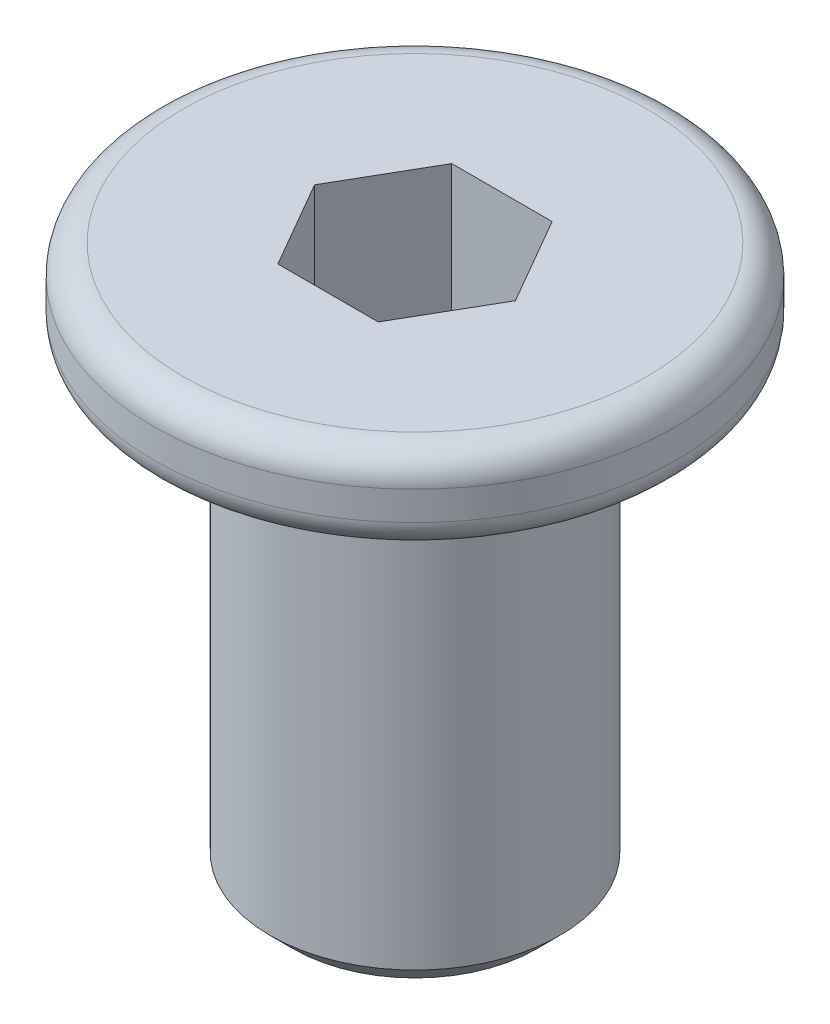
ISO-10303-21;
HEADER;
FILE_DESCRIPTION(('STEP AP214'),'2;1');
FILE_NAME('part.step','',(''),(''),'','','');
FILE_SCHEMA(('AUTOMOTIVE_DESIGN { 1 0 10303 214 1 1 1 1 }'));
ENDSEC;
DATA;
#1=APPLICATION_CONTEXT('core data for automotive mechanical design processes');
#2=APPLICATION_PROTOCOL_DEFINITION('international standard','automotive_design',2000,#1);
#3=PRODUCT_CONTEXT('',#1,'mechanical');
#4=PRODUCT('Part','Part','',(#3));
#5=PRODUCT_RELATED_PRODUCT_CATEGORY('part','',(#4));
#6=PRODUCT_DEFINITION_FORMATION('','',#4);
#7=PRODUCT_DEFINITION_CONTEXT('part definition',#1,'design');
#8=PRODUCT_DEFINITION('design','',#6,#7);
#9=PRODUCT_DEFINITION_SHAPE('','',#8);
#10=(LENGTH_UNIT() NAMED_UNIT(*) SI_UNIT(.MILLI.,.METRE.));
#11=(NAMED_UNIT(*) PLANE_ANGLE_UNIT() SI_UNIT($,.RADIAN.));
#12=(NAMED_UNIT(*) SI_UNIT($,.STERADIAN.) SOLID_ANGLE_UNIT());
#13=UNCERTAINTY_MEASURE_WITH_UNIT(LENGTH_MEASURE(1.E-05),#10,'distance_accuracy_value','');
#14=(GEOMETRIC_REPRESENTATION_CONTEXT(3) GLOBAL_UNCERTAINTY_ASSIGNED_CONTEXT((#13)) GLOBAL_UNIT_ASSIGNED_CONTEXT((#10,
#11,#12)) REPRESENTATION_CONTEXT('',''));
#15=CARTESIAN_POINT('',(0.,0.,0.));
#16=DIRECTION('',(0.,0.,1.));
#17=DIRECTION('',(1.,0.,0.));
#18=AXIS2_PLACEMENT_3D('',#15,#16,#17);
#19=CARTESIAN_POINT('',(0.,-1.,0.));
#20=DIRECTION('',(0.,1.,0.));
#21=DIRECTION('',(0.,0.,1.));
#22=AXIS2_PLACEMENT_3D('',#19,#20,#21);
#23=TOROIDAL_SURFACE('',#22,4.,0.5);
#24=CARTESIAN_POINT('',(0.,-1.5,0.));
#25=DIRECTION('',(0.,1.,0.));
#26=DIRECTION('',(0.,0.,1.));
#27=AXIS2_PLACEMENT_3D('',#24,#25,#26);
#28=CIRCLE('',#27,4.);
#29=CARTESIAN_POINT('',(0.,-1.5,4.));
#30=VERTEX_POINT('',#29);
#31=EDGE_CURVE('E190',#30,#30,#28,.T.);
#32=ORIENTED_EDGE('',*,*,#31,.T.);
#33=EDGE_LOOP('',(#32));
#34=FACE_BOUND('',#33,.T.);
#35=CARTESIAN_POINT('',(0.,-0.999999999999997,0.));
#36=DIRECTION('',(0.,1.,0.));
#37=DIRECTION('',(0.,0.,1.));
#38=AXIS2_PLACEMENT_3D('',#35,#36,#37);
#39=CIRCLE('',#38,4.5);
#40=CARTESIAN_POINT('',(0.,-0.999999999999997,4.5));
#41=VERTEX_POINT('',#40);
#42=EDGE_CURVE('E157',#41,#41,#39,.T.);
#43=ORIENTED_EDGE('',*,*,#42,.F.);
#44=EDGE_LOOP('',(#43));
#45=FACE_BOUND('',#44,.T.);
#46=ADVANCED_FACE('F45',(#34,#45),#23,.T.);
#47=CARTESIAN_POINT('',(-4.,-1.5,0.));
#48=DIRECTION('',(0.,-1.,0.));
#49=DIRECTION('',(0.,0.,-1.));
#50=AXIS2_PLACEMENT_3D('',#47,#48,#49);
#51=PLANE('',#50);
#52=CARTESIAN_POINT('',(0.,-1.5,0.));
#53=DIRECTION('',(0.,1.,0.));
#54=DIRECTION('',(0.,0.,1.));
#55=AXIS2_PLACEMENT_3D('',#52,#53,#54);
#56=CIRCLE('',#55,2.5);
#57=CARTESIAN_POINT('',(0.,-1.5,2.5));
#58=VERTEX_POINT('',#57);
#59=EDGE_CURVE('E187',#58,#58,#56,.T.);
#60=ORIENTED_EDGE('',*,*,#59,.T.);
#61=EDGE_LOOP('',(#60));
#62=FACE_BOUND('',#61,.T.);
#63=ORIENTED_EDGE('',*,*,#31,.F.);
#64=EDGE_LOOP('',(#63));
#65=FACE_BOUND('',#64,.T.);
#66=ADVANCED_FACE('F250',(#62,#65),#51,.T.);
#67=CARTESIAN_POINT('',(0.,2.75,0.));
#68=DIRECTION('',(0.,1.,0.));
#69=DIRECTION('',(0.,0.,1.));
#70=AXIS2_PLACEMENT_3D('',#67,#68,#69);
#71=CYLINDRICAL_SURFACE('',#70,2.5);
#72=CARTESIAN_POINT('',(0.,-9.1,0.));
#73=DIRECTION('',(0.,1.,0.));
#74=DIRECTION('',(0.,0.,1.));
#75=AXIS2_PLACEMENT_3D('',#72,#73,#74);
#76=CIRCLE('',#75,2.5);
#77=CARTESIAN_POINT('',(0.,-9.1,2.5));
#78=VERTEX_POINT('',#77);
#79=EDGE_CURVE('E184',#78,#78,#76,.T.);
#80=ORIENTED_EDGE('',*,*,#79,.T.);
#81=EDGE_LOOP('',(#80));
#82=FACE_BOUND('',#81,.T.);
#83=ORIENTED_EDGE('',*,*,#59,.F.);
#84=EDGE_LOOP('',(#83));
#85=FACE_BOUND('',#84,.T.);
#86=ADVANCED_FACE('F255',(#82,#85),#71,.T.);
#87=CARTESIAN_POINT('',(0.,-9.1,0.));
#88=DIRECTION('',(0.,1.,0.));
#89=DIRECTION('',(0.,0.,1.));
#90=AXIS2_PLACEMENT_3D('',#87,#88,#89);
#91=CONICAL_SURFACE('',#90,2.5,0.785398163397449);
#92=CARTESIAN_POINT('',(0.,-9.5,0.));
#93=DIRECTION('',(0.,1.,0.));
#94=DIRECTION('',(0.,0.,1.));
#95=AXIS2_PLACEMENT_3D('',#92,#93,#94);
#96=CIRCLE('',#95,2.1);
#97=CARTESIAN_POINT('',(0.,-9.5,2.1));
#98=VERTEX_POINT('',#97);
#99=EDGE_CURVE('E180',#98,#98,#96,.T.);
#100=ORIENTED_EDGE('',*,*,#99,.T.);
#101=EDGE_LOOP('',(#100));
#102=FACE_BOUND('',#101,.T.);
#103=ORIENTED_EDGE('',*,*,#79,.F.);
#104=EDGE_LOOP('',(#103));
#105=FACE_BOUND('',#104,.T.);
#106=ADVANCED_FACE('F281',(#102,#105),#91,.T.);
#107=CARTESIAN_POINT('',(-2.1,-9.5,0.));
#108=DIRECTION('',(0.,-1.,0.));
#109=DIRECTION('',(0.,0.,-1.));
#110=AXIS2_PLACEMENT_3D('',#107,#108,#109);
#111=PLANE('',#110);
#112=ORIENTED_EDGE('',*,*,#99,.F.);
#113=EDGE_LOOP('',(#112));
#114=FACE_BOUND('',#113,.T.);
#115=ADVANCED_FACE('F275',(#114),#111,.T.);
#116=CARTESIAN_POINT('',(-4.,0.,0.));
#117=DIRECTION('',(0.,1.,0.));
#118=DIRECTION('',(0.,0.,1.));
#119=AXIS2_PLACEMENT_3D('',#116,#117,#118);
#120=PLANE('',#119);
#121=DIRECTION('',(-1.,0.,0.));
#122=VECTOR('',#121,1.);
#123=CARTESIAN_POINT('',(-4.,0.,-1.5));
#124=LINE('',#123,#122);
#125=CARTESIAN_POINT('',(0.866025403784437,0.,-1.5));
#126=VERTEX_POINT('',#125);
#127=CARTESIAN_POINT('',(-0.866025403784439,0.,-1.5));
#128=VERTEX_POINT('',#127);
#129=EDGE_CURVE('E11',#126,#128,#124,.T.);
#130=ORIENTED_EDGE('',*,*,#129,.F.);
#131=DIRECTION('',(-0.500000000000001,0.,-0.866025403784438));
#132=VECTOR('',#131,1.);
#133=CARTESIAN_POINT('',(0.299038105676656,0.,-2.48205080756888));
#134=LINE('',#133,#132);
#135=CARTESIAN_POINT('',(1.73205080756888,0.,0.));
#136=VERTEX_POINT('',#135);
#137=EDGE_CURVE('E52',#136,#126,#134,.T.);
#138=ORIENTED_EDGE('',*,*,#137,.F.);
#139=DIRECTION('',(0.5,0.,-0.866025403784439));
#140=VECTOR('',#139,1.);
#141=CARTESIAN_POINT('',(0.299038105676658,0.,2.48205080756888));
#142=LINE('',#141,#140);
#143=CARTESIAN_POINT('',(0.866025403784438,0.,1.5));
#144=VERTEX_POINT('',#143);
#145=EDGE_CURVE('E195',#144,#136,#142,.T.);
#146=ORIENTED_EDGE('',*,*,#145,.F.);
#147=DIRECTION('',(1.,0.,0.));
#148=VECTOR('',#147,1.);
#149=CARTESIAN_POINT('',(-4.,0.,1.5));
#150=LINE('',#149,#148);
#151=CARTESIAN_POINT('',(-0.866025403784438,0.,1.5));
#152=VERTEX_POINT('',#151);
#153=EDGE_CURVE('E193',#152,#144,#150,.T.);
#154=ORIENTED_EDGE('',*,*,#153,.F.);
#155=DIRECTION('',(0.5,0.,0.866025403784439));
#156=VECTOR('',#155,1.);
#157=CARTESIAN_POINT('',(-2.29903810567666,0.,-0.982050807568876));
#158=LINE('',#157,#156);
#159=CARTESIAN_POINT('',(-1.73205080756888,0.,0.));
#160=VERTEX_POINT('',#159);
#161=EDGE_CURVE('E128',#160,#152,#158,.T.);
#162=ORIENTED_EDGE('',*,*,#161,.F.);
#163=DIRECTION('',(-0.5,0.,0.866025403784439));
#164=VECTOR('',#163,1.);
#165=CARTESIAN_POINT('',(-2.29903810567666,0.,0.982050807568876));
#166=LINE('',#165,#164);
#167=EDGE_CURVE('E198',#128,#160,#166,.T.);
#168=ORIENTED_EDGE('',*,*,#167,.F.);
#169=EDGE_LOOP('',(#130,#138,#146,#154,#162,#168));
#170=FACE_BOUND('',#169,.T.);
#171=CARTESIAN_POINT('',(0.,0.,0.));
#172=DIRECTION('',(0.,1.,0.));
#173=DIRECTION('',(0.,0.,1.));
#174=AXIS2_PLACEMENT_3D('',#171,#172,#173);
#175=CIRCLE('',#174,4.);
#176=CARTESIAN_POINT('',(0.,0.,4.));
#177=VERTEX_POINT('',#176);
#178=EDGE_CURVE('E174',#177,#177,#175,.T.);
#179=ORIENTED_EDGE('',*,*,#178,.T.);
#180=EDGE_LOOP('',(#179));
#181=FACE_BOUND('',#180,.T.);
#182=ADVANCED_FACE('F270',(#170,#181),#120,.T.);
#183=CARTESIAN_POINT('',(0.,-0.5,0.));
#184=DIRECTION('',(0.,1.,0.));
#185=DIRECTION('',(0.,0.,1.));
#186=AXIS2_PLACEMENT_3D('',#183,#184,#185);
#187=TOROIDAL_SURFACE('',#186,4.,0.5);
#188=CARTESIAN_POINT('',(0.,-0.500000000000003,0.));
#189=DIRECTION('',(0.,1.,0.));
#190=DIRECTION('',(0.,0.,1.));
#191=AXIS2_PLACEMENT_3D('',#188,#189,#190);
#192=CIRCLE('',#191,4.5);
#193=CARTESIAN_POINT('',(0.,-0.500000000000003,4.5));
#194=VERTEX_POINT('',#193);
#195=EDGE_CURVE('E171',#194,#194,#192,.T.);
#196=ORIENTED_EDGE('',*,*,#195,.T.);
#197=EDGE_LOOP('',(#196));
#198=FACE_BOUND('',#197,.T.);
#199=ORIENTED_EDGE('',*,*,#178,.F.);
#200=EDGE_LOOP('',(#199));
#201=FACE_BOUND('',#200,.T.);
#202=ADVANCED_FACE('F264',(#198,#201),#187,.T.);
#203=CARTESIAN_POINT('',(0.,2.75,0.));
#204=DIRECTION('',(0.,1.,0.));
#205=DIRECTION('',(0.,0.,1.));
#206=AXIS2_PLACEMENT_3D('',#203,#204,#205);
#207=CYLINDRICAL_SURFACE('',#206,4.5);
#208=ORIENTED_EDGE('',*,*,#42,.T.);
#209=EDGE_LOOP('',(#208));
#210=FACE_BOUND('',#209,.T.);
#211=ORIENTED_EDGE('',*,*,#195,.F.);
#212=EDGE_LOOP('',(#211));
#213=FACE_BOUND('',#212,.T.);
#214=ADVANCED_FACE('F261',(#210,#213),#207,.T.);
#215=CARTESIAN_POINT('',(0.,-3.,0.));
#216=DIRECTION('',(0.,1.,0.));
#217=DIRECTION('',(0.,0.,1.));
#218=AXIS2_PLACEMENT_3D('',#215,#216,#217);
#219=PLANE('',#218);
#220=DIRECTION('',(1.,0.,0.));
#221=VECTOR('',#220,1.);
#222=CARTESIAN_POINT('',(-0.866025403784438,-3.,1.5));
#223=LINE('',#222,#221);
#224=CARTESIAN_POINT('',(0.,-3.,1.5));
#225=VERTEX_POINT('',#224);
#226=CARTESIAN_POINT('',(0.866025403784438,-3.,1.5));
#227=VERTEX_POINT('',#226);
#228=EDGE_CURVE('E136',#225,#227,#223,.T.);
#229=ORIENTED_EDGE('',*,*,#228,.T.);
#230=DIRECTION('',(0.5,0.,-0.866025403784438));
#231=VECTOR('',#230,1.);
#232=CARTESIAN_POINT('',(0.866025403784438,-3.,1.5));
#233=LINE('',#232,#231);
#234=CARTESIAN_POINT('',(1.29903810567666,-3.,0.750000000000001));
#235=VERTEX_POINT('',#234);
#236=EDGE_CURVE('E140',#227,#235,#233,.T.);
#237=ORIENTED_EDGE('',*,*,#236,.T.);
#238=CARTESIAN_POINT('',(0.,-3.,0.));
#239=DIRECTION('',(0.,1.,0.));
#240=DIRECTION('',(0.,0.,1.));
#241=AXIS2_PLACEMENT_3D('',#238,#239,#240);
#242=CIRCLE('',#241,1.5);
#243=EDGE_CURVE('E177',#225,#235,#242,.T.);
#244=ORIENTED_EDGE('',*,*,#243,.F.);
#245=EDGE_LOOP('',(#229,#237,#244));
#246=FACE_BOUND('',#245,.T.);
#247=ADVANCED_FACE('F229',(#246),#219,.T.);
#248=CARTESIAN_POINT('',(1.73205080756888,-3.,0.));
#249=VERTEX_POINT('',#248);
#250=EDGE_CURVE('E138',#235,#249,#233,.T.);
#251=ORIENTED_EDGE('',*,*,#250,.T.);
#252=DIRECTION('',(-0.500000000000001,0.,-0.866025403784438));
#253=VECTOR('',#252,1.);
#254=CARTESIAN_POINT('',(1.73205080756888,-3.,0.));
#255=LINE('',#254,#253);
#256=CARTESIAN_POINT('',(1.29903810567666,-3.,-0.750000000000001));
#257=VERTEX_POINT('',#256);
#258=EDGE_CURVE('E145',#249,#257,#255,.T.);
#259=ORIENTED_EDGE('',*,*,#258,.T.);
#260=EDGE_CURVE('E181',#235,#257,#242,.T.);
#261=ORIENTED_EDGE('',*,*,#260,.F.);
#262=EDGE_LOOP('',(#251,#259,#261));
#263=FACE_BOUND('',#262,.T.);
#264=ADVANCED_FACE('F222',(#263),#219,.T.);
#265=CARTESIAN_POINT('',(0.866025403784437,-3.,-1.5));
#266=VERTEX_POINT('',#265);
#267=EDGE_CURVE('E144',#257,#266,#255,.T.);
#268=ORIENTED_EDGE('',*,*,#267,.T.);
#269=DIRECTION('',(-1.,0.,0.));
#270=VECTOR('',#269,1.);
#271=CARTESIAN_POINT('',(0.866025403784437,-3.,-1.5));
#272=LINE('',#271,#270);
#273=CARTESIAN_POINT('',(0.,-3.,-1.5));
#274=VERTEX_POINT('',#273);
#275=EDGE_CURVE('E149',#266,#274,#272,.T.);
#276=ORIENTED_EDGE('',*,*,#275,.T.);
#277=EDGE_CURVE('E218',#257,#274,#242,.T.);
#278=ORIENTED_EDGE('',*,*,#277,.F.);
#279=EDGE_LOOP('',(#268,#276,#278));
#280=FACE_BOUND('',#279,.T.);
#281=ADVANCED_FACE('F236',(#280),#219,.T.);
#282=CARTESIAN_POINT('',(-0.866025403784439,-3.,-1.5));
#283=VERTEX_POINT('',#282);
#284=EDGE_CURVE('E148',#274,#283,#272,.T.);
#285=ORIENTED_EDGE('',*,*,#284,.T.);
#286=DIRECTION('',(-0.5,0.,0.866025403784439));
#287=VECTOR('',#286,1.);
#288=CARTESIAN_POINT('',(-0.866025403784439,-3.,-1.5));
#289=LINE('',#288,#287);
#290=CARTESIAN_POINT('',(-1.29903810567666,-3.,-0.75));
#291=VERTEX_POINT('',#290);
#292=EDGE_CURVE('E132',#283,#291,#289,.T.);
#293=ORIENTED_EDGE('',*,*,#292,.T.);
#294=EDGE_CURVE('E217',#274,#291,#242,.T.);
#295=ORIENTED_EDGE('',*,*,#294,.F.);
#296=EDGE_LOOP('',(#285,#293,#295));
#297=FACE_BOUND('',#296,.T.);
#298=ADVANCED_FACE('F241',(#297),#219,.T.);
#299=CARTESIAN_POINT('',(-1.73205080756888,-3.,0.));
#300=VERTEX_POINT('',#299);
#301=EDGE_CURVE('E152',#291,#300,#289,.T.);
#302=ORIENTED_EDGE('',*,*,#301,.T.);
#303=DIRECTION('',(0.5,0.,0.866025403784438));
#304=VECTOR('',#303,1.);
#305=CARTESIAN_POINT('',(-1.73205080756888,-3.,0.));
#306=LINE('',#305,#304);
#307=CARTESIAN_POINT('',(-1.29903810567666,-3.,0.75));
#308=VERTEX_POINT('',#307);
#309=EDGE_CURVE('E121',#300,#308,#306,.T.);
#310=ORIENTED_EDGE('',*,*,#309,.T.);
#311=EDGE_CURVE('E212',#291,#308,#242,.T.);
#312=ORIENTED_EDGE('',*,*,#311,.F.);
#313=EDGE_LOOP('',(#302,#310,#312));
#314=FACE_BOUND('',#313,.T.);
#315=ADVANCED_FACE('F211',(#314),#219,.T.);
#316=CARTESIAN_POINT('',(-1.73205080756888,-3.,0.));
#317=DIRECTION('',(-0.866025403784438,0.,0.5));
#318=DIRECTION('',(0.5,0.,0.866025403784439));
#319=AXIS2_PLACEMENT_3D('',#316,#317,#318);
#320=PLANE('',#319);
#321=ORIENTED_EDGE('',*,*,#309,.F.);
#322=DIRECTION('',(0.,1.,0.));
#323=VECTOR('',#322,1.);
#324=CARTESIAN_POINT('',(-1.73205080756888,-3.,0.));
#325=LINE('',#324,#323);
#326=EDGE_CURVE('E155',#300,#160,#325,.T.);
#327=ORIENTED_EDGE('',*,*,#326,.T.);
#328=ORIENTED_EDGE('',*,*,#161,.T.);
#329=DIRECTION('',(0.,1.,0.));
#330=VECTOR('',#329,1.);
#331=CARTESIAN_POINT('',(-0.866025403784438,-3.,1.5));
#332=LINE('',#331,#330);
#333=CARTESIAN_POINT('',(-0.866025403784438,-3.,1.5));
#334=VERTEX_POINT('',#333);
#335=EDGE_CURVE('E125',#334,#152,#332,.T.);
#336=ORIENTED_EDGE('',*,*,#335,.F.);
#337=EDGE_CURVE('E113',#308,#334,#306,.T.);
#338=ORIENTED_EDGE('',*,*,#337,.F.);
#339=EDGE_LOOP('',(#321,#327,#328,#336,#338));
#340=FACE_BOUND('',#339,.T.);
#341=ADVANCED_FACE('F126',(#340),#320,.F.);
#342=CARTESIAN_POINT('',(-0.866025403784439,-3.,-1.5));
#343=DIRECTION('',(-0.866025403784439,0.,-0.5));
#344=DIRECTION('',(-0.5,0.,0.866025403784439));
#345=AXIS2_PLACEMENT_3D('',#342,#343,#344);
#346=PLANE('',#345);
#347=ORIENTED_EDGE('',*,*,#292,.F.);
#348=DIRECTION('',(0.,1.,0.));
#349=VECTOR('',#348,1.);
#350=CARTESIAN_POINT('',(-0.866025403784439,-3.,-1.5));
#351=LINE('',#350,#349);
#352=EDGE_CURVE('E158',#283,#128,#351,.T.);
#353=ORIENTED_EDGE('',*,*,#352,.T.);
#354=ORIENTED_EDGE('',*,*,#167,.T.);
#355=ORIENTED_EDGE('',*,*,#326,.F.);
#356=ORIENTED_EDGE('',*,*,#301,.F.);
#357=EDGE_LOOP('',(#347,#353,#354,#355,#356));
#358=FACE_BOUND('',#357,.T.);
#359=ADVANCED_FACE('F205',(#358),#346,.F.);
#360=CARTESIAN_POINT('',(0.866025403784437,-3.,-1.5));
#361=DIRECTION('',(0.,0.,-1.));
#362=DIRECTION('',(-1.,0.,0.));
#363=AXIS2_PLACEMENT_3D('',#360,#361,#362);
#364=PLANE('',#363);
#365=ORIENTED_EDGE('',*,*,#275,.F.);
#366=DIRECTION('',(0.,1.,0.));
#367=VECTOR('',#366,1.);
#368=CARTESIAN_POINT('',(0.866025403784437,-3.,-1.5));
#369=LINE('',#368,#367);
#370=EDGE_CURVE('E161',#266,#126,#369,.T.);
#371=ORIENTED_EDGE('',*,*,#370,.T.);
#372=ORIENTED_EDGE('',*,*,#129,.T.);
#373=ORIENTED_EDGE('',*,*,#352,.F.);
#374=ORIENTED_EDGE('',*,*,#284,.F.);
#375=EDGE_LOOP('',(#365,#371,#372,#373,#374));
#376=FACE_BOUND('',#375,.T.);
#377=ADVANCED_FACE('F239',(#376),#364,.F.);
#378=CARTESIAN_POINT('',(1.73205080756888,-3.,0.));
#379=DIRECTION('',(0.866025403784438,0.,-0.5));
#380=DIRECTION('',(-0.500000000000001,0.,-0.866025403784438));
#381=AXIS2_PLACEMENT_3D('',#378,#379,#380);
#382=PLANE('',#381);
#383=ORIENTED_EDGE('',*,*,#258,.F.);
#384=DIRECTION('',(0.,1.,0.));
#385=VECTOR('',#384,1.);
#386=CARTESIAN_POINT('',(1.73205080756888,-3.,0.));
#387=LINE('',#386,#385);
#388=EDGE_CURVE('E164',#249,#136,#387,.T.);
#389=ORIENTED_EDGE('',*,*,#388,.T.);
#390=ORIENTED_EDGE('',*,*,#137,.T.);
#391=ORIENTED_EDGE('',*,*,#370,.F.);
#392=ORIENTED_EDGE('',*,*,#267,.F.);
#393=EDGE_LOOP('',(#383,#389,#390,#391,#392));
#394=FACE_BOUND('',#393,.T.);
#395=ADVANCED_FACE('F231',(#394),#382,.F.);
#396=CARTESIAN_POINT('',(0.866025403784438,-3.,1.5));
#397=DIRECTION('',(0.866025403784438,0.,0.5));
#398=DIRECTION('',(0.5,0.,-0.866025403784439));
#399=AXIS2_PLACEMENT_3D('',#396,#397,#398);
#400=PLANE('',#399);
#401=ORIENTED_EDGE('',*,*,#236,.F.);
#402=DIRECTION('',(0.,1.,0.));
#403=VECTOR('',#402,1.);
#404=CARTESIAN_POINT('',(0.866025403784438,-3.,1.5));
#405=LINE('',#404,#403);
#406=EDGE_CURVE('E131',#227,#144,#405,.T.);
#407=ORIENTED_EDGE('',*,*,#406,.T.);
#408=ORIENTED_EDGE('',*,*,#145,.T.);
#409=ORIENTED_EDGE('',*,*,#388,.F.);
#410=ORIENTED_EDGE('',*,*,#250,.F.);
#411=EDGE_LOOP('',(#401,#407,#408,#409,#410));
#412=FACE_BOUND('',#411,.T.);
#413=ADVANCED_FACE('F227',(#412),#400,.F.);
#414=CARTESIAN_POINT('',(-0.866025403784438,-3.,1.5));
#415=DIRECTION('',(0.,0.,1.));
#416=DIRECTION('',(1.,0.,0.));
#417=AXIS2_PLACEMENT_3D('',#414,#415,#416);
#418=PLANE('',#417);
#419=EDGE_CURVE('E59',#334,#225,#223,.T.);
#420=ORIENTED_EDGE('',*,*,#419,.F.);
#421=ORIENTED_EDGE('',*,*,#335,.T.);
#422=ORIENTED_EDGE('',*,*,#153,.T.);
#423=ORIENTED_EDGE('',*,*,#406,.F.);
#424=ORIENTED_EDGE('',*,*,#228,.F.);
#425=EDGE_LOOP('',(#420,#421,#422,#423,#424));
#426=FACE_BOUND('',#425,.T.);
#427=ADVANCED_FACE('F134',(#426),#418,.F.);
#428=ORIENTED_EDGE('',*,*,#337,.T.);
#429=ORIENTED_EDGE('',*,*,#419,.T.);
#430=EDGE_CURVE('E117',#308,#225,#242,.T.);
#431=ORIENTED_EDGE('',*,*,#430,.F.);
#432=EDGE_LOOP('',(#428,#429,#431));
#433=FACE_BOUND('',#432,.T.);
#434=ADVANCED_FACE('F115',(#433),#219,.T.);
#435=CARTESIAN_POINT('',(0.,-4.,0.));
#436=DIRECTION('',(0.,1.,0.));
#437=DIRECTION('',(0.,0.,1.));
#438=AXIS2_PLACEMENT_3D('',#435,#436,#437);
#439=CONICAL_SURFACE('',#438,0.,0.982793723247329);
#440=ORIENTED_EDGE('',*,*,#243,.T.);
#441=ORIENTED_EDGE('',*,*,#260,.T.);
#442=ORIENTED_EDGE('',*,*,#277,.T.);
#443=ORIENTED_EDGE('',*,*,#294,.T.);
#444=ORIENTED_EDGE('',*,*,#311,.T.);
#445=ORIENTED_EDGE('',*,*,#430,.T.);
#446=EDGE_LOOP('',(#440,#441,#442,#443,#444,#445));
#447=FACE_BOUND('',#446,.T.);
#448=CARTESIAN_POINT('',(0.,-4.,0.));
#449=VERTEX_POINT('',#448);
#450=VERTEX_LOOP('',#449);
#451=FACE_BOUND('',#450,.T.);
#452=ADVANCED_FACE('F215',(#447,#451),#439,.F.);
#453=CLOSED_SHELL('',(#46,#66,#86,#106,#115,#182,#202,#214,#247,#264,#281,#298,#315,#341,#359,
#377,#395,#413,#427,#434,#452));
#454=MANIFOLD_SOLID_BREP('B2',#453);
#455=ADVANCED_BREP_SHAPE_REPRESENTATION('',(#18,#454),#14);
#456=SHAPE_DEFINITION_REPRESENTATION(#9,#455);
ENDSEC;
END-ISO-10303-21;
